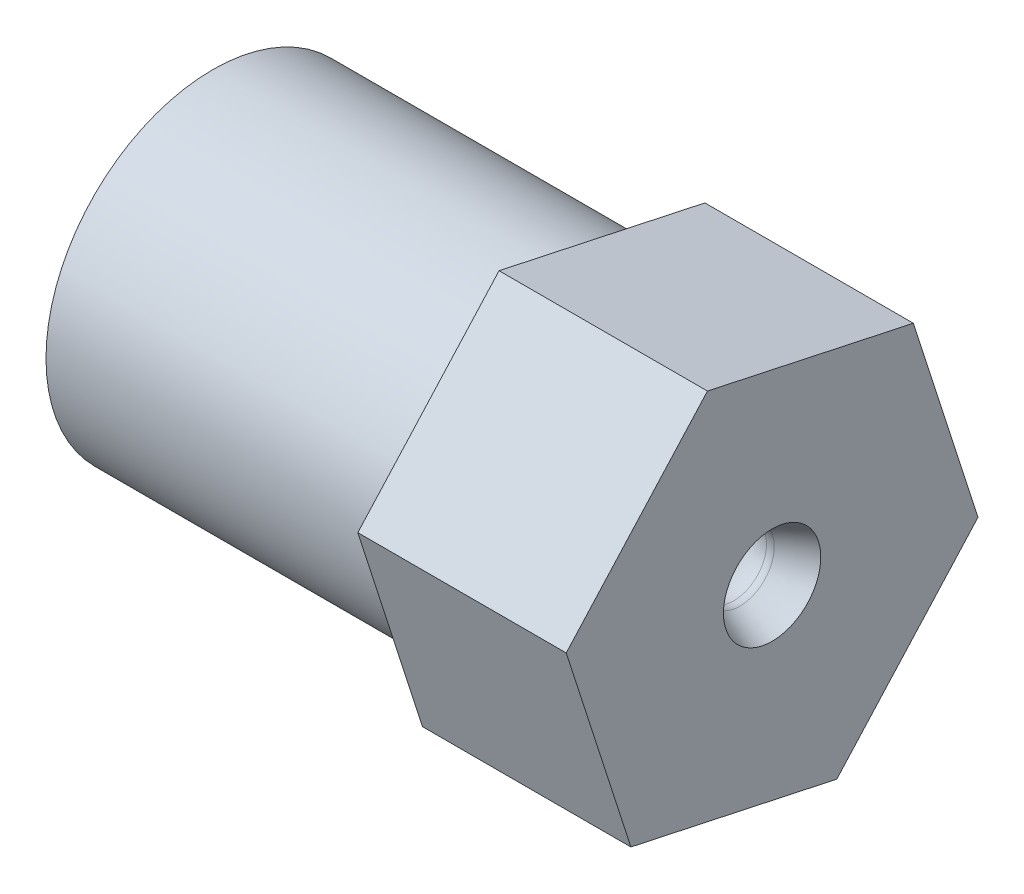
ISO-10303-21;
HEADER;
FILE_DESCRIPTION(('STEP AP214'),'2;1');
FILE_NAME('part.step','',(''),(''),'','','');
FILE_SCHEMA(('AUTOMOTIVE_DESIGN { 1 0 10303 214 1 1 1 1 }'));
ENDSEC;
DATA;
#1=APPLICATION_CONTEXT('core data for automotive mechanical design processes');
#2=APPLICATION_PROTOCOL_DEFINITION('international standard','automotive_design',2000,#1);
#3=PRODUCT_CONTEXT('',#1,'mechanical');
#4=PRODUCT('Part','Part','',(#3));
#5=PRODUCT_RELATED_PRODUCT_CATEGORY('part','',(#4));
#6=PRODUCT_DEFINITION_FORMATION('','',#4);
#7=PRODUCT_DEFINITION_CONTEXT('part definition',#1,'design');
#8=PRODUCT_DEFINITION('design','',#6,#7);
#9=PRODUCT_DEFINITION_SHAPE('','',#8);
#10=(LENGTH_UNIT() NAMED_UNIT(*) SI_UNIT(.MILLI.,.METRE.));
#11=(NAMED_UNIT(*) PLANE_ANGLE_UNIT() SI_UNIT($,.RADIAN.));
#12=(NAMED_UNIT(*) SI_UNIT($,.STERADIAN.) SOLID_ANGLE_UNIT());
#13=UNCERTAINTY_MEASURE_WITH_UNIT(LENGTH_MEASURE(1.E-05),#10,'distance_accuracy_value','');
#14=(GEOMETRIC_REPRESENTATION_CONTEXT(3) GLOBAL_UNCERTAINTY_ASSIGNED_CONTEXT((#13)) GLOBAL_UNIT_ASSIGNED_CONTEXT((#10,
#11,#12)) REPRESENTATION_CONTEXT('',''));
#15=CARTESIAN_POINT('',(0.,0.,0.));
#16=DIRECTION('',(0.,0.,1.));
#17=DIRECTION('',(1.,0.,0.));
#18=AXIS2_PLACEMENT_3D('',#15,#16,#17);
#19=CARTESIAN_POINT('',(0.,0.,0.));
#20=DIRECTION('',(-1.,0.,0.));
#21=DIRECTION('',(0.,0.,1.));
#22=AXIS2_PLACEMENT_3D('',#19,#20,#21);
#23=CYLINDRICAL_SURFACE('',#22,10.16);
#24=CARTESIAN_POINT('',(-10.9971923039475,0.,0.));
#25=DIRECTION('',(1.,0.,0.));
#26=DIRECTION('',(0.,0.,-1.));
#27=AXIS2_PLACEMENT_3D('',#24,#25,#26);
#28=CIRCLE('',#27,10.16);
#29=CARTESIAN_POINT('',(-10.9971923039475,0.,-10.16));
#30=VERTEX_POINT('',#29);
#31=EDGE_CURVE('E11',#30,#30,#28,.F.);
#32=ORIENTED_EDGE('',*,*,#31,.T.);
#33=EDGE_LOOP('',(#32));
#34=FACE_BOUND('',#33,.T.);
#35=CARTESIAN_POINT('',(-31.75,0.,0.));
#36=DIRECTION('',(-1.,0.,0.));
#37=DIRECTION('',(0.,0.,1.));
#38=AXIS2_PLACEMENT_3D('',#35,#36,#37);
#39=CIRCLE('',#38,10.16);
#40=CARTESIAN_POINT('',(-31.75,0.,10.16));
#41=VERTEX_POINT('',#40);
#42=EDGE_CURVE('E225',#41,#41,#39,.T.);
#43=ORIENTED_EDGE('',*,*,#42,.F.);
#44=EDGE_LOOP('',(#43));
#45=FACE_BOUND('',#44,.T.);
#46=ADVANCED_FACE('F37',(#34,#45),#23,.T.);
#47=CARTESIAN_POINT('',(0.,0.,0.));
#48=DIRECTION('',(-1.,0.,0.));
#49=DIRECTION('',(0.,0.,1.));
#50=AXIS2_PLACEMENT_3D('',#47,#48,#49);
#51=TOROIDAL_SURFACE('',#50,5.,3.);
#52=CARTESIAN_POINT('',(0.,0.,0.));
#53=DIRECTION('',(-1.,0.,0.));
#54=DIRECTION('',(0.,0.,1.));
#55=AXIS2_PLACEMENT_3D('',#52,#53,#54);
#56=CIRCLE('',#55,1.99999999999667);
#57=CARTESIAN_POINT('',(0.,0.,1.99999999999667));
#58=VERTEX_POINT('',#57);
#59=EDGE_CURVE('E177',#58,#58,#56,.T.);
#60=ORIENTED_EDGE('',*,*,#59,.F.);
#61=EDGE_LOOP('',(#60));
#62=FACE_BOUND('',#61,.T.);
#63=CARTESIAN_POINT('',(-2.12132034355962,0.,0.));
#64=DIRECTION('',(-1.,0.,0.));
#65=DIRECTION('',(0.,0.,1.));
#66=AXIS2_PLACEMENT_3D('',#63,#64,#65);
#67=CIRCLE('',#66,2.87867965644033);
#68=CARTESIAN_POINT('',(-2.12132034355962,0.,2.87867965644033));
#69=VERTEX_POINT('',#68);
#70=EDGE_CURVE('E142',#69,#69,#67,.T.);
#71=ORIENTED_EDGE('',*,*,#70,.T.);
#72=EDGE_LOOP('',(#71));
#73=FACE_BOUND('',#72,.T.);
#74=ADVANCED_FACE('F166',(#62,#73),#51,.T.);
#75=CARTESIAN_POINT('',(0.,0.,0.));
#76=DIRECTION('',(-1.,0.,0.));
#77=DIRECTION('',(0.,0.,1.));
#78=AXIS2_PLACEMENT_3D('',#75,#76,#77);
#79=TOROIDAL_SURFACE('',#78,2.8,0.800000000003326);
#80=CARTESIAN_POINT('',(0.375577255373294,0.,0.));
#81=DIRECTION('',(-1.,0.,0.));
#82=DIRECTION('',(0.,0.,1.));
#83=AXIS2_PLACEMENT_3D('',#80,#81,#82);
#84=CIRCLE('',#83,2.09364192846051);
#85=CARTESIAN_POINT('',(0.375577255373294,0.,2.09364192846051));
#86=VERTEX_POINT('',#85);
#87=EDGE_CURVE('E231',#86,#86,#84,.T.);
#88=ORIENTED_EDGE('',*,*,#87,.F.);
#89=EDGE_LOOP('',(#88));
#90=FACE_BOUND('',#89,.T.);
#91=ORIENTED_EDGE('',*,*,#59,.T.);
#92=EDGE_LOOP('',(#91));
#93=FACE_BOUND('',#92,.T.);
#94=ADVANCED_FACE('F162',(#90,#93),#79,.T.);
#95=CARTESIAN_POINT('',(464596.757500356,-885537.678862807,0.));
#96=CARTESIAN_POINT('',(-469471.187209675,882949.686500303,0.));
#97=CARTESIAN_POINT('',(474347.119227995,-880353.319570096,0.));
#98=B_SPLINE_CURVE_WITH_KNOTS('',2,(#95,#96,#97),.UNSPECIFIED.,.F.,.F.,(3,3),(0.,1.),.UNSPECIFIED.);
#99=CARTESIAN_POINT('',(0.,0.,0.));
#100=DIRECTION('',(-1.,0.,0.));
#101=AXIS1_PLACEMENT('',#99,#100);
#102=SURFACE_OF_REVOLUTION('',#98,#101);
#103=CARTESIAN_POINT('',(2.33780769605253,0.,0.));
#104=DIRECTION('',(-1.,0.,0.));
#105=DIRECTION('',(0.,0.,1.));
#106=AXIS2_PLACEMENT_3D('',#103,#104,#105);
#107=CIRCLE('',#106,2.96647939483827);
#108=CARTESIAN_POINT('',(2.33780769605253,0.,2.96647939483827));
#109=VERTEX_POINT('',#108);
#110=EDGE_CURVE('E228',#109,#109,#107,.T.);
#111=ORIENTED_EDGE('',*,*,#110,.F.);
#112=EDGE_LOOP('',(#111));
#113=FACE_BOUND('',#112,.T.);
#114=ORIENTED_EDGE('',*,*,#87,.T.);
#115=EDGE_LOOP('',(#114));
#116=FACE_BOUND('',#115,.T.);
#117=ADVANCED_FACE('F157',(#113,#116),#102,.T.);
#118=CARTESIAN_POINT('',(2.33780769605253,10.16,0.));
#119=DIRECTION('',(-1.,0.,0.));
#120=DIRECTION('',(0.,0.,1.));
#121=AXIS2_PLACEMENT_3D('',#118,#119,#120);
#122=PLANE('',#121);
#123=ORIENTED_EDGE('',*,*,#110,.T.);
#124=EDGE_LOOP('',(#123));
#125=FACE_BOUND('',#124,.T.);
#126=DIRECTION('',(0.,-0.951681663898051,-0.307086324345838));
#127=VECTOR('',#126,1.);
#128=CARTESIAN_POINT('',(2.33780769605253,-3.41249677929312,10.5755624900671));
#129=LINE('',#128,#127);
#130=CARTESIAN_POINT('',(2.33780769605253,2.69330707117882,12.5457684242007));
#131=VERTEX_POINT('',#130);
#132=CARTESIAN_POINT('',(2.33780769605253,-9.51830062976507,8.60535655593348));
#133=VERTEX_POINT('',#132);
#134=EDGE_CURVE('E125',#131,#133,#129,.T.);
#135=ORIENTED_EDGE('',*,*,#134,.T.);
#136=DIRECTION('',(0.,-0.209896273910742,-0.977723659424475));
#137=VECTOR('',#136,1.);
#138=CARTESIAN_POINT('',(2.33780769605253,-10.8649541653545,2.33247234383312));
#139=LINE('',#138,#137);
#140=CARTESIAN_POINT('',(2.33780769605253,-12.2116077009439,-3.94041186826723));
#141=VERTEX_POINT('',#140);
#142=EDGE_CURVE('E128',#133,#141,#139,.T.);
#143=ORIENTED_EDGE('',*,*,#142,.T.);
#144=DIRECTION('',(0.,0.741785389987309,-0.670637335078637));
#145=VECTOR('',#144,1.);
#146=CARTESIAN_POINT('',(2.33780769605253,-7.45245738606136,-8.24309014623397));
#147=LINE('',#146,#145);
#148=CARTESIAN_POINT('',(2.33780769605253,-2.69330707117882,-12.5457684242007));
#149=VERTEX_POINT('',#148);
#150=EDGE_CURVE('E131',#141,#149,#147,.T.);
#151=ORIENTED_EDGE('',*,*,#150,.T.);
#152=DIRECTION('',(0.,0.951681663898051,0.307086324345838));
#153=VECTOR('',#152,1.);
#154=CARTESIAN_POINT('',(2.33780769605253,3.41249677929312,-10.5755624900671));
#155=LINE('',#154,#153);
#156=CARTESIAN_POINT('',(2.33780769605253,9.51830062976506,-8.60535655593348));
#157=VERTEX_POINT('',#156);
#158=EDGE_CURVE('E134',#149,#157,#155,.T.);
#159=ORIENTED_EDGE('',*,*,#158,.T.);
#160=DIRECTION('',(0.,0.209896273910742,0.977723659424475));
#161=VECTOR('',#160,1.);
#162=CARTESIAN_POINT('',(2.33780769605253,10.8649541653545,-2.33247234383312));
#163=LINE('',#162,#161);
#164=CARTESIAN_POINT('',(2.33780769605253,12.2116077009439,3.94041186826724));
#165=VERTEX_POINT('',#164);
#166=EDGE_CURVE('E102',#157,#165,#163,.T.);
#167=ORIENTED_EDGE('',*,*,#166,.T.);
#168=DIRECTION('',(0.,-0.741785389987309,0.670637335078637));
#169=VECTOR('',#168,1.);
#170=CARTESIAN_POINT('',(2.33780769605253,7.45245738606136,8.24309014623397));
#171=LINE('',#170,#169);
#172=EDGE_CURVE('E137',#165,#131,#171,.T.);
#173=ORIENTED_EDGE('',*,*,#172,.T.);
#174=EDGE_LOOP('',(#135,#143,#151,#159,#167,#173));
#175=FACE_BOUND('',#174,.T.);
#176=ADVANCED_FACE('F161',(#125,#175),#122,.F.);
#177=CARTESIAN_POINT('',(-31.75,10.16,0.));
#178=DIRECTION('',(1.,0.,0.));
#179=DIRECTION('',(0.,0.,-1.));
#180=AXIS2_PLACEMENT_3D('',#177,#178,#179);
#181=PLANE('',#180);
#182=CARTESIAN_POINT('',(-31.75,0.,0.));
#183=DIRECTION('',(-1.,0.,0.));
#184=DIRECTION('',(0.,0.,1.));
#185=AXIS2_PLACEMENT_3D('',#182,#183,#184);
#186=CIRCLE('',#185,8.6614);
#187=CARTESIAN_POINT('',(-31.75,0.,8.6614));
#188=VERTEX_POINT('',#187);
#189=EDGE_CURVE('E222',#188,#188,#186,.T.);
#190=ORIENTED_EDGE('',*,*,#189,.F.);
#191=EDGE_LOOP('',(#190));
#192=FACE_BOUND('',#191,.T.);
#193=ORIENTED_EDGE('',*,*,#42,.T.);
#194=EDGE_LOOP('',(#193));
#195=FACE_BOUND('',#194,.T.);
#196=ADVANCED_FACE('F249',(#192,#195),#181,.F.);
#197=CARTESIAN_POINT('',(-31.115,0.,0.));
#198=DIRECTION('',(-1.,0.,0.));
#199=DIRECTION('',(0.,0.,1.));
#200=AXIS2_PLACEMENT_3D('',#197,#198,#199);
#201=TOROIDAL_SURFACE('',#200,8.6614,0.635);
#202=CARTESIAN_POINT('',(-31.115,0.,0.));
#203=DIRECTION('',(-1.,0.,0.));
#204=DIRECTION('',(0.,0.,1.));
#205=AXIS2_PLACEMENT_3D('',#202,#203,#204);
#206=CIRCLE('',#205,8.02639999999999);
#207=CARTESIAN_POINT('',(-31.115,0.,8.02639999999999));
#208=VERTEX_POINT('',#207);
#209=EDGE_CURVE('E219',#208,#208,#206,.T.);
#210=ORIENTED_EDGE('',*,*,#209,.F.);
#211=EDGE_LOOP('',(#210));
#212=FACE_BOUND('',#211,.T.);
#213=ORIENTED_EDGE('',*,*,#189,.T.);
#214=EDGE_LOOP('',(#213));
#215=FACE_BOUND('',#214,.T.);
#216=ADVANCED_FACE('F251',(#212,#215),#201,.T.);
#217=CARTESIAN_POINT('',(0.,0.,0.));
#218=DIRECTION('',(-1.,0.,0.));
#219=DIRECTION('',(0.,0.,1.));
#220=AXIS2_PLACEMENT_3D('',#217,#218,#219);
#221=CYLINDRICAL_SURFACE('',#220,8.02639999999999);
#222=CARTESIAN_POINT('',(-25.019,0.,0.));
#223=DIRECTION('',(-1.,0.,0.));
#224=DIRECTION('',(0.,0.,1.));
#225=AXIS2_PLACEMENT_3D('',#222,#223,#224);
#226=CIRCLE('',#225,8.02639999999999);
#227=CARTESIAN_POINT('',(-25.019,0.,8.02639999999999));
#228=VERTEX_POINT('',#227);
#229=EDGE_CURVE('E216',#228,#228,#226,.T.);
#230=ORIENTED_EDGE('',*,*,#229,.F.);
#231=EDGE_LOOP('',(#230));
#232=FACE_BOUND('',#231,.T.);
#233=ORIENTED_EDGE('',*,*,#209,.T.);
#234=EDGE_LOOP('',(#233));
#235=FACE_BOUND('',#234,.T.);
#236=ADVANCED_FACE('F258',(#232,#235),#221,.F.);
#237=CARTESIAN_POINT('',(-25.019,0.,0.));
#238=DIRECTION('',(-1.,0.,0.));
#239=DIRECTION('',(0.,0.,1.));
#240=AXIS2_PLACEMENT_3D('',#237,#238,#239);
#241=TOROIDAL_SURFACE('',#240,7.89939999999999,0.127);
#242=CARTESIAN_POINT('',(-24.892,0.,0.));
#243=DIRECTION('',(-1.,0.,0.));
#244=DIRECTION('',(0.,0.,1.));
#245=AXIS2_PLACEMENT_3D('',#242,#243,#244);
#246=CIRCLE('',#245,7.89939999999999);
#247=CARTESIAN_POINT('',(-24.892,0.,7.89939999999999));
#248=VERTEX_POINT('',#247);
#249=EDGE_CURVE('E213',#248,#248,#246,.T.);
#250=ORIENTED_EDGE('',*,*,#249,.F.);
#251=EDGE_LOOP('',(#250));
#252=FACE_BOUND('',#251,.T.);
#253=ORIENTED_EDGE('',*,*,#229,.T.);
#254=EDGE_LOOP('',(#253));
#255=FACE_BOUND('',#254,.T.);
#256=ADVANCED_FACE('F266',(#252,#255),#241,.F.);
#257=CARTESIAN_POINT('',(-24.892,6.9469,0.));
#258=DIRECTION('',(1.,0.,0.));
#259=DIRECTION('',(0.,0.,-1.));
#260=AXIS2_PLACEMENT_3D('',#257,#258,#259);
#261=PLANE('',#260);
#262=CARTESIAN_POINT('',(-24.892,0.,0.));
#263=DIRECTION('',(-1.,0.,0.));
#264=DIRECTION('',(0.,0.,1.));
#265=AXIS2_PLACEMENT_3D('',#262,#263,#264);
#266=CIRCLE('',#265,6.9469);
#267=CARTESIAN_POINT('',(-24.892,0.,6.9469));
#268=VERTEX_POINT('',#267);
#269=EDGE_CURVE('E210',#268,#268,#266,.T.);
#270=ORIENTED_EDGE('',*,*,#269,.F.);
#271=EDGE_LOOP('',(#270));
#272=FACE_BOUND('',#271,.T.);
#273=ORIENTED_EDGE('',*,*,#249,.T.);
#274=EDGE_LOOP('',(#273));
#275=FACE_BOUND('',#274,.T.);
#276=ADVANCED_FACE('F270',(#272,#275),#261,.F.);
#277=CARTESIAN_POINT('',(0.,0.,0.));
#278=DIRECTION('',(-1.,0.,0.));
#279=DIRECTION('',(0.,0.,1.));
#280=AXIS2_PLACEMENT_3D('',#277,#278,#279);
#281=CYLINDRICAL_SURFACE('',#280,6.9469);
#282=CARTESIAN_POINT('',(-20.066,0.,0.));
#283=DIRECTION('',(-1.,0.,0.));
#284=DIRECTION('',(0.,0.,1.));
#285=AXIS2_PLACEMENT_3D('',#282,#283,#284);
#286=CIRCLE('',#285,6.9469);
#287=CARTESIAN_POINT('',(-20.066,0.,6.9469));
#288=VERTEX_POINT('',#287);
#289=EDGE_CURVE('E207',#288,#288,#286,.T.);
#290=ORIENTED_EDGE('',*,*,#289,.F.);
#291=EDGE_LOOP('',(#290));
#292=FACE_BOUND('',#291,.T.);
#293=ORIENTED_EDGE('',*,*,#269,.T.);
#294=EDGE_LOOP('',(#293));
#295=FACE_BOUND('',#294,.T.);
#296=ADVANCED_FACE('F274',(#292,#295),#281,.F.);
#297=CARTESIAN_POINT('',(-20.066,0.,0.));
#298=DIRECTION('',(-1.,0.,0.));
#299=DIRECTION('',(0.,0.,1.));
#300=AXIS2_PLACEMENT_3D('',#297,#298,#299);
#301=TOROIDAL_SURFACE('',#300,6.8199,0.127);
#302=CARTESIAN_POINT('',(-19.939,0.,0.));
#303=DIRECTION('',(-1.,0.,0.));
#304=DIRECTION('',(0.,0.,1.));
#305=AXIS2_PLACEMENT_3D('',#302,#303,#304);
#306=CIRCLE('',#305,6.8199);
#307=CARTESIAN_POINT('',(-19.939,0.,6.8199));
#308=VERTEX_POINT('',#307);
#309=EDGE_CURVE('E204',#308,#308,#306,.T.);
#310=ORIENTED_EDGE('',*,*,#309,.F.);
#311=EDGE_LOOP('',(#310));
#312=FACE_BOUND('',#311,.T.);
#313=ORIENTED_EDGE('',*,*,#289,.T.);
#314=EDGE_LOOP('',(#313));
#315=FACE_BOUND('',#314,.T.);
#316=ADVANCED_FACE('F278',(#312,#315),#301,.F.);
#317=CARTESIAN_POINT('',(-19.939,5.46100000000001,0.));
#318=DIRECTION('',(1.,0.,0.));
#319=DIRECTION('',(0.,0.,-1.));
#320=AXIS2_PLACEMENT_3D('',#317,#318,#319);
#321=PLANE('',#320);
#322=CARTESIAN_POINT('',(-19.939,0.,0.));
#323=DIRECTION('',(-1.,0.,0.));
#324=DIRECTION('',(0.,0.,1.));
#325=AXIS2_PLACEMENT_3D('',#322,#323,#324);
#326=CIRCLE('',#325,5.46100000000001);
#327=CARTESIAN_POINT('',(-19.939,0.,5.46100000000001));
#328=VERTEX_POINT('',#327);
#329=EDGE_CURVE('E201',#328,#328,#326,.T.);
#330=ORIENTED_EDGE('',*,*,#329,.F.);
#331=EDGE_LOOP('',(#330));
#332=FACE_BOUND('',#331,.T.);
#333=ORIENTED_EDGE('',*,*,#309,.T.);
#334=EDGE_LOOP('',(#333));
#335=FACE_BOUND('',#334,.T.);
#336=ADVANCED_FACE('F282',(#332,#335),#321,.F.);
#337=CARTESIAN_POINT('',(-19.304,0.,0.));
#338=DIRECTION('',(-1.,0.,0.));
#339=DIRECTION('',(0.,0.,1.));
#340=AXIS2_PLACEMENT_3D('',#337,#338,#339);
#341=TOROIDAL_SURFACE('',#340,5.461,0.635);
#342=CARTESIAN_POINT('',(-19.304,0.,0.));
#343=DIRECTION('',(-1.,0.,0.));
#344=DIRECTION('',(0.,0.,1.));
#345=AXIS2_PLACEMENT_3D('',#342,#343,#344);
#346=CIRCLE('',#345,4.826);
#347=CARTESIAN_POINT('',(-19.304,0.,4.826));
#348=VERTEX_POINT('',#347);
#349=EDGE_CURVE('E198',#348,#348,#346,.T.);
#350=ORIENTED_EDGE('',*,*,#349,.F.);
#351=EDGE_LOOP('',(#350));
#352=FACE_BOUND('',#351,.T.);
#353=ORIENTED_EDGE('',*,*,#329,.T.);
#354=EDGE_LOOP('',(#353));
#355=FACE_BOUND('',#354,.T.);
#356=ADVANCED_FACE('F286',(#352,#355),#341,.T.);
#357=CARTESIAN_POINT('',(0.,0.,0.));
#358=DIRECTION('',(-1.,0.,0.));
#359=DIRECTION('',(0.,0.,1.));
#360=AXIS2_PLACEMENT_3D('',#357,#358,#359);
#361=CYLINDRICAL_SURFACE('',#360,4.826);
#362=CARTESIAN_POINT('',(-13.589,0.,0.));
#363=DIRECTION('',(-1.,0.,0.));
#364=DIRECTION('',(0.,0.,1.));
#365=AXIS2_PLACEMENT_3D('',#362,#363,#364);
#366=CIRCLE('',#365,4.826);
#367=CARTESIAN_POINT('',(-13.589,0.,4.826));
#368=VERTEX_POINT('',#367);
#369=EDGE_CURVE('E195',#368,#368,#366,.T.);
#370=ORIENTED_EDGE('',*,*,#369,.F.);
#371=EDGE_LOOP('',(#370));
#372=FACE_BOUND('',#371,.T.);
#373=ORIENTED_EDGE('',*,*,#349,.T.);
#374=EDGE_LOOP('',(#373));
#375=FACE_BOUND('',#374,.T.);
#376=ADVANCED_FACE('F290',(#372,#375),#361,.F.);
#377=CARTESIAN_POINT('',(-13.589,0.,0.));
#378=DIRECTION('',(-1.,0.,0.));
#379=DIRECTION('',(0.,0.,1.));
#380=AXIS2_PLACEMENT_3D('',#377,#378,#379);
#381=TOROIDAL_SURFACE('',#380,4.699,0.127);
#382=CARTESIAN_POINT('',(-13.462,0.,0.));
#383=DIRECTION('',(-1.,0.,0.));
#384=DIRECTION('',(0.,0.,1.));
#385=AXIS2_PLACEMENT_3D('',#382,#383,#384);
#386=CIRCLE('',#385,4.699);
#387=CARTESIAN_POINT('',(-13.462,0.,4.699));
#388=VERTEX_POINT('',#387);
#389=EDGE_CURVE('E192',#388,#388,#386,.T.);
#390=ORIENTED_EDGE('',*,*,#389,.F.);
#391=EDGE_LOOP('',(#390));
#392=FACE_BOUND('',#391,.T.);
#393=ORIENTED_EDGE('',*,*,#369,.T.);
#394=EDGE_LOOP('',(#393));
#395=FACE_BOUND('',#394,.T.);
#396=ADVANCED_FACE('F294',(#392,#395),#381,.F.);
#397=CARTESIAN_POINT('',(-13.462,4.445,0.));
#398=DIRECTION('',(1.,0.,0.));
#399=DIRECTION('',(0.,0.,-1.));
#400=AXIS2_PLACEMENT_3D('',#397,#398,#399);
#401=PLANE('',#400);
#402=CARTESIAN_POINT('',(-13.462,0.,0.));
#403=DIRECTION('',(-1.,0.,0.));
#404=DIRECTION('',(0.,0.,1.));
#405=AXIS2_PLACEMENT_3D('',#402,#403,#404);
#406=CIRCLE('',#405,4.445);
#407=CARTESIAN_POINT('',(-13.462,0.,4.445));
#408=VERTEX_POINT('',#407);
#409=EDGE_CURVE('E187',#408,#408,#406,.T.);
#410=ORIENTED_EDGE('',*,*,#409,.F.);
#411=EDGE_LOOP('',(#410));
#412=FACE_BOUND('',#411,.T.);
#413=ORIENTED_EDGE('',*,*,#389,.T.);
#414=EDGE_LOOP('',(#413));
#415=FACE_BOUND('',#414,.T.);
#416=ADVANCED_FACE('F298',(#412,#415),#401,.F.);
#417=CARTESIAN_POINT('',(0.,0.,0.));
#418=DIRECTION('',(-1.,0.,0.));
#419=DIRECTION('',(0.,0.,1.));
#420=AXIS2_PLACEMENT_3D('',#417,#418,#419);
#421=CYLINDRICAL_SURFACE('',#420,4.445);
#422=CARTESIAN_POINT('',(-5.00276874765387,0.,0.));
#423=DIRECTION('',(-1.,0.,0.));
#424=DIRECTION('',(0.,0.,1.));
#425=AXIS2_PLACEMENT_3D('',#422,#423,#424);
#426=CIRCLE('',#425,4.445);
#427=CARTESIAN_POINT('',(-5.00276874765387,0.,4.445));
#428=VERTEX_POINT('',#427);
#429=EDGE_CURVE('E183',#428,#428,#426,.T.);
#430=ORIENTED_EDGE('',*,*,#429,.F.);
#431=EDGE_LOOP('',(#430));
#432=FACE_BOUND('',#431,.T.);
#433=ORIENTED_EDGE('',*,*,#409,.T.);
#434=EDGE_LOOP('',(#433));
#435=FACE_BOUND('',#434,.T.);
#436=ADVANCED_FACE('F302',(#432,#435),#421,.F.);
#437=CARTESIAN_POINT('',(-5.00276874765388,0.,0.));
#438=DIRECTION('',(-1.,0.,0.));
#439=DIRECTION('',(0.,0.,1.));
#440=AXIS2_PLACEMENT_3D('',#437,#438,#439);
#441=DEGENERATE_TOROIDAL_SURFACE('',#440,1.27,3.175,.T.);
#442=CARTESIAN_POINT('',(-2.75770471738661,0.,0.));
#443=DIRECTION('',(-1.,0.,0.));
#444=DIRECTION('',(0.,0.,1.));
#445=AXIS2_PLACEMENT_3D('',#442,#443,#444);
#446=CIRCLE('',#445,3.51506403026731);
#447=CARTESIAN_POINT('',(-2.75770471738661,0.,3.51506403026731));
#448=VERTEX_POINT('',#447);
#449=EDGE_CURVE('E181',#448,#448,#446,.T.);
#450=ORIENTED_EDGE('',*,*,#449,.F.);
#451=EDGE_LOOP('',(#450));
#452=FACE_BOUND('',#451,.T.);
#453=ORIENTED_EDGE('',*,*,#429,.T.);
#454=EDGE_LOOP('',(#453));
#455=FACE_BOUND('',#454,.T.);
#456=ADVANCED_FACE('F306',(#452,#455),#441,.F.);
#457=CARTESIAN_POINT('',(-2.75770471738661,0.,0.));
#458=DIRECTION('',(-1.,0.,0.));
#459=DIRECTION('',(0.,0.,1.));
#460=AXIS2_PLACEMENT_3D('',#457,#458,#459);
#461=CONICAL_SURFACE('',#460,3.51506403026731,0.785398163397436);
#462=ORIENTED_EDGE('',*,*,#70,.F.);
#463=EDGE_LOOP('',(#462));
#464=FACE_BOUND('',#463,.T.);
#465=ORIENTED_EDGE('',*,*,#449,.T.);
#466=EDGE_LOOP('',(#465));
#467=FACE_BOUND('',#466,.T.);
#468=ADVANCED_FACE('F310',(#464,#467),#461,.F.);
#469=CARTESIAN_POINT('',(-10.3621923039475,-3.41249677929312,10.5755624900671));
#470=DIRECTION('',(0.,-0.307086324345838,0.951681663898051));
#471=DIRECTION('',(0.,-0.951681663898051,-0.307086324345838));
#472=AXIS2_PLACEMENT_3D('',#469,#470,#471);
#473=PLANE('',#472);
#474=ORIENTED_EDGE('',*,*,#134,.F.);
#475=DIRECTION('',(1.,0.,0.));
#476=VECTOR('',#475,1.);
#477=CARTESIAN_POINT('',(-10.3621923039475,2.69330707117882,12.5457684242007));
#478=LINE('',#477,#476);
#479=CARTESIAN_POINT('',(-10.3621923039475,2.69330707117882,12.5457684242007));
#480=VERTEX_POINT('',#479);
#481=EDGE_CURVE('E54',#480,#131,#478,.T.);
#482=ORIENTED_EDGE('',*,*,#481,.F.);
#483=DIRECTION('',(0.,-0.951681663898051,-0.307086324345838));
#484=VECTOR('',#483,1.);
#485=CARTESIAN_POINT('',(-10.3621923039475,-3.41249677929312,10.5755624900671));
#486=LINE('',#485,#484);
#487=CARTESIAN_POINT('',(-10.3621923039475,-9.51830062976507,8.60535655593348));
#488=VERTEX_POINT('',#487);
#489=EDGE_CURVE('E140',#480,#488,#486,.T.);
#490=ORIENTED_EDGE('',*,*,#489,.T.);
#491=DIRECTION('',(1.,0.,0.));
#492=VECTOR('',#491,1.);
#493=CARTESIAN_POINT('',(-10.3621923039475,-9.51830062976507,8.60535655593348));
#494=LINE('',#493,#492);
#495=EDGE_CURVE('E89',#488,#133,#494,.T.);
#496=ORIENTED_EDGE('',*,*,#495,.T.);
#497=EDGE_LOOP('',(#474,#482,#490,#496));
#498=FACE_BOUND('',#497,.T.);
#499=ADVANCED_FACE('F314',(#498),#473,.T.);
#500=CARTESIAN_POINT('',(-10.3621923039475,7.45245738606136,8.24309014623397));
#501=DIRECTION('',(0.,0.670637335078637,0.741785389987309));
#502=DIRECTION('',(0.,-0.741785389987309,0.670637335078637));
#503=AXIS2_PLACEMENT_3D('',#500,#501,#502);
#504=PLANE('',#503);
#505=ORIENTED_EDGE('',*,*,#172,.F.);
#506=DIRECTION('',(1.,0.,0.));
#507=VECTOR('',#506,1.);
#508=CARTESIAN_POINT('',(-10.3621923039475,12.2116077009439,3.94041186826724));
#509=LINE('',#508,#507);
#510=CARTESIAN_POINT('',(-10.3621923039475,12.2116077009439,3.94041186826724));
#511=VERTEX_POINT('',#510);
#512=EDGE_CURVE('E77',#511,#165,#509,.T.);
#513=ORIENTED_EDGE('',*,*,#512,.F.);
#514=DIRECTION('',(0.,-0.741785389987309,0.670637335078637));
#515=VECTOR('',#514,1.);
#516=CARTESIAN_POINT('',(-10.3621923039475,7.45245738606136,8.24309014623397));
#517=LINE('',#516,#515);
#518=EDGE_CURVE('E115',#511,#480,#517,.T.);
#519=ORIENTED_EDGE('',*,*,#518,.T.);
#520=ORIENTED_EDGE('',*,*,#481,.T.);
#521=EDGE_LOOP('',(#505,#513,#519,#520));
#522=FACE_BOUND('',#521,.T.);
#523=ADVANCED_FACE('F317',(#522),#504,.T.);
#524=CARTESIAN_POINT('',(-10.3621923039475,10.8649541653545,-2.33247234383312));
#525=DIRECTION('',(0.,0.977723659424475,-0.209896273910742));
#526=DIRECTION('',(0.,0.209896273910742,0.977723659424475));
#527=AXIS2_PLACEMENT_3D('',#524,#525,#526);
#528=PLANE('',#527);
#529=ORIENTED_EDGE('',*,*,#166,.F.);
#530=DIRECTION('',(1.,0.,0.));
#531=VECTOR('',#530,1.);
#532=CARTESIAN_POINT('',(-10.3621923039475,9.51830062976506,-8.60535655593348));
#533=LINE('',#532,#531);
#534=CARTESIAN_POINT('',(-10.3621923039475,9.51830062976506,-8.60535655593348));
#535=VERTEX_POINT('',#534);
#536=EDGE_CURVE('E97',#535,#157,#533,.T.);
#537=ORIENTED_EDGE('',*,*,#536,.F.);
#538=DIRECTION('',(0.,0.209896273910742,0.977723659424475));
#539=VECTOR('',#538,1.);
#540=CARTESIAN_POINT('',(-10.3621923039475,10.8649541653545,-2.33247234383312));
#541=LINE('',#540,#539);
#542=EDGE_CURVE('E100',#535,#511,#541,.T.);
#543=ORIENTED_EDGE('',*,*,#542,.T.);
#544=ORIENTED_EDGE('',*,*,#512,.T.);
#545=EDGE_LOOP('',(#529,#537,#543,#544));
#546=FACE_BOUND('',#545,.T.);
#547=ADVANCED_FACE('F99',(#546),#528,.T.);
#548=CARTESIAN_POINT('',(-10.3621923039475,3.41249677929312,-10.5755624900671));
#549=DIRECTION('',(0.,0.307086324345838,-0.951681663898051));
#550=DIRECTION('',(0.,0.951681663898051,0.307086324345838));
#551=AXIS2_PLACEMENT_3D('',#548,#549,#550);
#552=PLANE('',#551);
#553=ORIENTED_EDGE('',*,*,#158,.F.);
#554=DIRECTION('',(1.,0.,0.));
#555=VECTOR('',#554,1.);
#556=CARTESIAN_POINT('',(-10.3621923039475,-2.69330707117882,-12.5457684242007));
#557=LINE('',#556,#555);
#558=CARTESIAN_POINT('',(-10.3621923039475,-2.69330707117882,-12.5457684242007));
#559=VERTEX_POINT('',#558);
#560=EDGE_CURVE('E107',#559,#149,#557,.T.);
#561=ORIENTED_EDGE('',*,*,#560,.F.);
#562=DIRECTION('',(0.,0.951681663898051,0.307086324345838));
#563=VECTOR('',#562,1.);
#564=CARTESIAN_POINT('',(-10.3621923039475,3.41249677929312,-10.5755624900671));
#565=LINE('',#564,#563);
#566=EDGE_CURVE('E113',#559,#535,#565,.T.);
#567=ORIENTED_EDGE('',*,*,#566,.T.);
#568=ORIENTED_EDGE('',*,*,#536,.T.);
#569=EDGE_LOOP('',(#553,#561,#567,#568));
#570=FACE_BOUND('',#569,.T.);
#571=ADVANCED_FACE('F117',(#570),#552,.T.);
#572=CARTESIAN_POINT('',(-10.3621923039475,-7.45245738606136,-8.24309014623397));
#573=DIRECTION('',(0.,-0.670637335078637,-0.741785389987309));
#574=DIRECTION('',(0.,0.741785389987309,-0.670637335078637));
#575=AXIS2_PLACEMENT_3D('',#572,#573,#574);
#576=PLANE('',#575);
#577=ORIENTED_EDGE('',*,*,#150,.F.);
#578=DIRECTION('',(1.,0.,0.));
#579=VECTOR('',#578,1.);
#580=CARTESIAN_POINT('',(-10.3621923039475,-12.2116077009439,-3.94041186826723));
#581=LINE('',#580,#579);
#582=CARTESIAN_POINT('',(-10.3621923039475,-12.2116077009439,-3.94041186826723));
#583=VERTEX_POINT('',#582);
#584=EDGE_CURVE('E145',#583,#141,#581,.T.);
#585=ORIENTED_EDGE('',*,*,#584,.F.);
#586=DIRECTION('',(0.,0.741785389987309,-0.670637335078637));
#587=VECTOR('',#586,1.);
#588=CARTESIAN_POINT('',(-10.3621923039475,-7.45245738606136,-8.24309014623397));
#589=LINE('',#588,#587);
#590=EDGE_CURVE('E118',#583,#559,#589,.T.);
#591=ORIENTED_EDGE('',*,*,#590,.T.);
#592=ORIENTED_EDGE('',*,*,#560,.T.);
#593=EDGE_LOOP('',(#577,#585,#591,#592));
#594=FACE_BOUND('',#593,.T.);
#595=ADVANCED_FACE('F320',(#594),#576,.T.);
#596=CARTESIAN_POINT('',(-10.3621923039475,-10.8649541653545,2.33247234383312));
#597=DIRECTION('',(0.,-0.977723659424475,0.209896273910742));
#598=DIRECTION('',(0.,-0.209896273910742,-0.977723659424475));
#599=AXIS2_PLACEMENT_3D('',#596,#597,#598);
#600=PLANE('',#599);
#601=ORIENTED_EDGE('',*,*,#142,.F.);
#602=ORIENTED_EDGE('',*,*,#495,.F.);
#603=DIRECTION('',(0.,-0.209896273910742,-0.977723659424475));
#604=VECTOR('',#603,1.);
#605=CARTESIAN_POINT('',(-10.3621923039475,-10.8649541653545,2.33247234383312));
#606=LINE('',#605,#604);
#607=EDGE_CURVE('E120',#488,#583,#606,.T.);
#608=ORIENTED_EDGE('',*,*,#607,.T.);
#609=ORIENTED_EDGE('',*,*,#584,.T.);
#610=EDGE_LOOP('',(#601,#602,#608,#609));
#611=FACE_BOUND('',#610,.T.);
#612=ADVANCED_FACE('F243',(#611),#600,.T.);
#613=CARTESIAN_POINT('',(-10.3621923039475,0.,0.));
#614=DIRECTION('',(1.,0.,0.));
#615=DIRECTION('',(0.,0.,-1.));
#616=AXIS2_PLACEMENT_3D('',#613,#614,#615);
#617=PLANE('',#616);
#618=CARTESIAN_POINT('',(-10.3621923039475,0.,0.));
#619=DIRECTION('',(1.,0.,0.));
#620=DIRECTION('',(0.,0.,-1.));
#621=AXIS2_PLACEMENT_3D('',#618,#619,#620);
#622=CIRCLE('',#621,10.795);
#623=CARTESIAN_POINT('',(-10.3621923039475,0.,-10.795));
#624=VERTEX_POINT('',#623);
#625=EDGE_CURVE('E46',#624,#624,#622,.T.);
#626=ORIENTED_EDGE('',*,*,#625,.T.);
#627=EDGE_LOOP('',(#626));
#628=FACE_BOUND('',#627,.T.);
#629=ORIENTED_EDGE('',*,*,#489,.F.);
#630=ORIENTED_EDGE('',*,*,#518,.F.);
#631=ORIENTED_EDGE('',*,*,#542,.F.);
#632=ORIENTED_EDGE('',*,*,#566,.F.);
#633=ORIENTED_EDGE('',*,*,#590,.F.);
#634=ORIENTED_EDGE('',*,*,#607,.F.);
#635=EDGE_LOOP('',(#629,#630,#631,#632,#633,#634));
#636=FACE_BOUND('',#635,.T.);
#637=ADVANCED_FACE('F111',(#628,#636),#617,.F.);
#638=CARTESIAN_POINT('',(-10.9971923039475,0.,0.));
#639=DIRECTION('',(1.,0.,0.));
#640=DIRECTION('',(0.,0.,-1.));
#641=AXIS2_PLACEMENT_3D('',#638,#639,#640);
#642=TOROIDAL_SURFACE('',#641,10.795,0.635);
#643=ORIENTED_EDGE('',*,*,#31,.F.);
#644=EDGE_LOOP('',(#643));
#645=FACE_BOUND('',#644,.T.);
#646=ORIENTED_EDGE('',*,*,#625,.F.);
#647=EDGE_LOOP('',(#646));
#648=FACE_BOUND('',#647,.T.);
#649=ADVANCED_FACE('F39',(#645,#648),#642,.F.);
#650=CLOSED_SHELL('',(#46,#74,#94,#117,#176,#196,#216,#236,#256,#276,#296,#316,#336,#356,#376,
#396,#416,#436,#456,#468,#499,#523,#547,#571,#595,#612,#637,#649));
#651=MANIFOLD_SOLID_BREP('B2',#650);
#652=ADVANCED_BREP_SHAPE_REPRESENTATION('',(#18,#651),#14);
#653=SHAPE_DEFINITION_REPRESENTATION(#9,#652);
ENDSEC;
END-ISO-10303-21;
